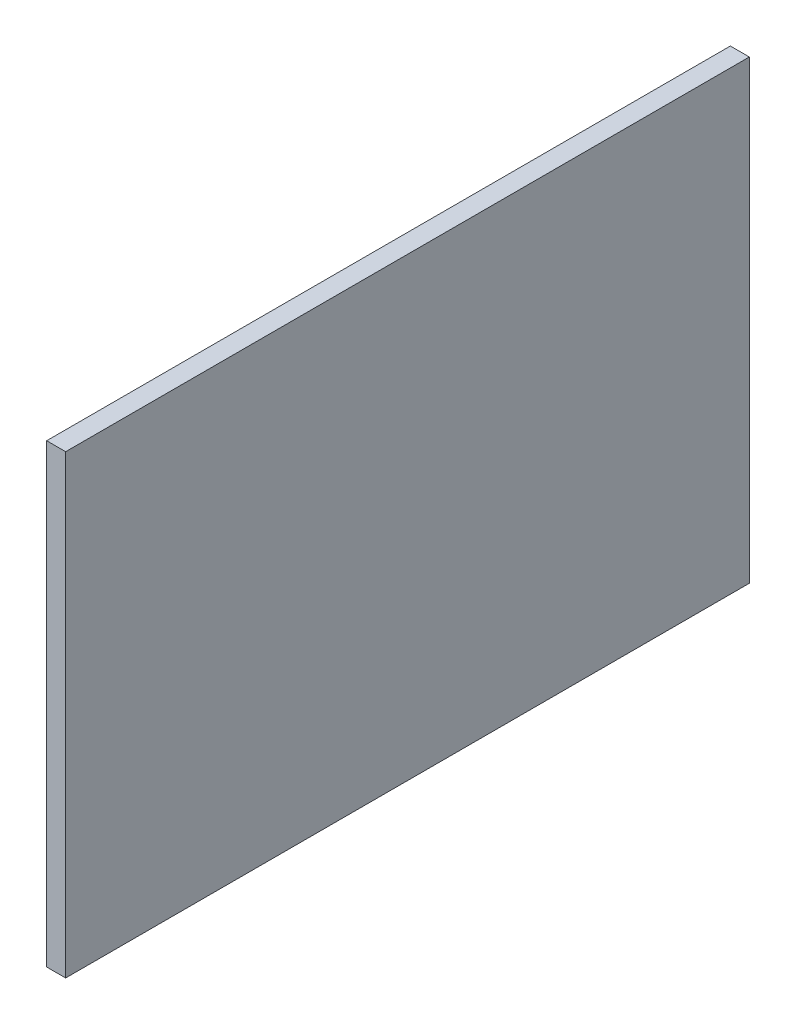
ISO-10303-21;
HEADER;
FILE_DESCRIPTION(('STEP AP214'),'2;1');
FILE_NAME('part.step','',(''),(''),'','','');
FILE_SCHEMA(('AUTOMOTIVE_DESIGN { 1 0 10303 214 1 1 1 1 }'));
ENDSEC;
DATA;
#1=APPLICATION_CONTEXT('core data for automotive mechanical design processes');
#2=APPLICATION_PROTOCOL_DEFINITION('international standard','automotive_design',2000,#1);
#3=PRODUCT_CONTEXT('',#1,'mechanical');
#4=PRODUCT('Part','Part','',(#3));
#5=PRODUCT_RELATED_PRODUCT_CATEGORY('part','',(#4));
#6=PRODUCT_DEFINITION_FORMATION('','',#4);
#7=PRODUCT_DEFINITION_CONTEXT('part definition',#1,'design');
#8=PRODUCT_DEFINITION('design','',#6,#7);
#9=PRODUCT_DEFINITION_SHAPE('','',#8);
#10=(LENGTH_UNIT() NAMED_UNIT(*) SI_UNIT(.MILLI.,.METRE.));
#11=(NAMED_UNIT(*) PLANE_ANGLE_UNIT() SI_UNIT($,.RADIAN.));
#12=(NAMED_UNIT(*) SI_UNIT($,.STERADIAN.) SOLID_ANGLE_UNIT());
#13=UNCERTAINTY_MEASURE_WITH_UNIT(LENGTH_MEASURE(1.E-05),#10,'distance_accuracy_value','');
#14=(GEOMETRIC_REPRESENTATION_CONTEXT(3) GLOBAL_UNCERTAINTY_ASSIGNED_CONTEXT((#13)) GLOBAL_UNIT_ASSIGNED_CONTEXT((#10,
#11,#12)) REPRESENTATION_CONTEXT('',''));
#15=CARTESIAN_POINT('',(0.,0.,0.));
#16=DIRECTION('',(0.,0.,1.));
#17=DIRECTION('',(1.,0.,0.));
#18=AXIS2_PLACEMENT_3D('',#15,#16,#17);
#19=CARTESIAN_POINT('',(12.7,0.,0.));
#20=DIRECTION('',(0.,0.,-1.));
#21=DIRECTION('',(-1.,0.,0.));
#22=AXIS2_PLACEMENT_3D('',#19,#20,#21);
#23=PLANE('',#22);
#24=DIRECTION('',(0.,-1.,0.));
#25=VECTOR('',#24,1.);
#26=CARTESIAN_POINT('',(0.,0.,0.));
#27=LINE('',#26,#25);
#28=CARTESIAN_POINT('',(0.,304.8,0.));
#29=VERTEX_POINT('',#28);
#30=CARTESIAN_POINT('',(0.,0.,0.));
#31=VERTEX_POINT('',#30);
#32=EDGE_CURVE('E107',#29,#31,#27,.T.);
#33=ORIENTED_EDGE('',*,*,#32,.T.);
#34=DIRECTION('',(-1.,0.,0.));
#35=VECTOR('',#34,1.);
#36=CARTESIAN_POINT('',(12.7,0.,0.));
#37=LINE('',#36,#35);
#38=CARTESIAN_POINT('',(12.7,0.,0.));
#39=VERTEX_POINT('',#38);
#40=EDGE_CURVE('E11',#39,#31,#37,.T.);
#41=ORIENTED_EDGE('',*,*,#40,.F.);
#42=DIRECTION('',(0.,-1.,0.));
#43=VECTOR('',#42,1.);
#44=CARTESIAN_POINT('',(12.7,0.,0.));
#45=LINE('',#44,#43);
#46=CARTESIAN_POINT('',(12.7,304.8,0.));
#47=VERTEX_POINT('',#46);
#48=EDGE_CURVE('E91',#47,#39,#45,.T.);
#49=ORIENTED_EDGE('',*,*,#48,.F.);
#50=DIRECTION('',(-1.,0.,0.));
#51=VECTOR('',#50,1.);
#52=CARTESIAN_POINT('',(12.7,304.8,0.));
#53=LINE('',#52,#51);
#54=EDGE_CURVE('E103',#47,#29,#53,.T.);
#55=ORIENTED_EDGE('',*,*,#54,.T.);
#56=EDGE_LOOP('',(#33,#41,#49,#55));
#57=FACE_BOUND('',#56,.T.);
#58=ADVANCED_FACE('F39',(#57),#23,.F.);
#59=CARTESIAN_POINT('',(12.7,0.,0.));
#60=DIRECTION('',(0.,1.,0.));
#61=DIRECTION('',(0.,0.,1.));
#62=AXIS2_PLACEMENT_3D('',#59,#60,#61);
#63=PLANE('',#62);
#64=DIRECTION('',(0.,0.,-1.));
#65=VECTOR('',#64,1.);
#66=CARTESIAN_POINT('',(0.,0.,0.));
#67=LINE('',#66,#65);
#68=CARTESIAN_POINT('',(0.,0.,-457.2));
#69=VERTEX_POINT('',#68);
#70=EDGE_CURVE('E96',#31,#69,#67,.T.);
#71=ORIENTED_EDGE('',*,*,#70,.T.);
#72=DIRECTION('',(-1.,0.,0.));
#73=VECTOR('',#72,1.);
#74=CARTESIAN_POINT('',(12.7,0.,-457.2));
#75=LINE('',#74,#73);
#76=CARTESIAN_POINT('',(12.7,0.,-457.2));
#77=VERTEX_POINT('',#76);
#78=EDGE_CURVE('E48',#77,#69,#75,.T.);
#79=ORIENTED_EDGE('',*,*,#78,.F.);
#80=DIRECTION('',(0.,0.,-1.));
#81=VECTOR('',#80,1.);
#82=CARTESIAN_POINT('',(12.7,0.,0.));
#83=LINE('',#82,#81);
#84=EDGE_CURVE('E86',#39,#77,#83,.T.);
#85=ORIENTED_EDGE('',*,*,#84,.F.);
#86=ORIENTED_EDGE('',*,*,#40,.T.);
#87=EDGE_LOOP('',(#71,#79,#85,#86));
#88=FACE_BOUND('',#87,.T.);
#89=ADVANCED_FACE('F95',(#88),#63,.F.);
#90=CARTESIAN_POINT('',(12.7,0.,-457.2));
#91=DIRECTION('',(0.,0.,1.));
#92=DIRECTION('',(1.,0.,0.));
#93=AXIS2_PLACEMENT_3D('',#90,#91,#92);
#94=PLANE('',#93);
#95=DIRECTION('',(0.,1.,0.));
#96=VECTOR('',#95,1.);
#97=CARTESIAN_POINT('',(0.,0.,-457.2));
#98=LINE('',#97,#96);
#99=CARTESIAN_POINT('',(0.,304.8,-457.2));
#100=VERTEX_POINT('',#99);
#101=EDGE_CURVE('E73',#69,#100,#98,.T.);
#102=ORIENTED_EDGE('',*,*,#101,.T.);
#103=DIRECTION('',(-1.,0.,0.));
#104=VECTOR('',#103,1.);
#105=CARTESIAN_POINT('',(12.7,304.8,-457.2));
#106=LINE('',#105,#104);
#107=CARTESIAN_POINT('',(12.7,304.8,-457.2));
#108=VERTEX_POINT('',#107);
#109=EDGE_CURVE('E98',#108,#100,#106,.T.);
#110=ORIENTED_EDGE('',*,*,#109,.F.);
#111=DIRECTION('',(0.,1.,0.));
#112=VECTOR('',#111,1.);
#113=CARTESIAN_POINT('',(12.7,0.,-457.2));
#114=LINE('',#113,#112);
#115=EDGE_CURVE('E89',#77,#108,#114,.T.);
#116=ORIENTED_EDGE('',*,*,#115,.F.);
#117=ORIENTED_EDGE('',*,*,#78,.T.);
#118=EDGE_LOOP('',(#102,#110,#116,#117));
#119=FACE_BOUND('',#118,.T.);
#120=ADVANCED_FACE('F99',(#119),#94,.F.);
#121=CARTESIAN_POINT('',(12.7,304.8,0.));
#122=DIRECTION('',(0.,-1.,0.));
#123=DIRECTION('',(0.,0.,-1.));
#124=AXIS2_PLACEMENT_3D('',#121,#122,#123);
#125=PLANE('',#124);
#126=DIRECTION('',(0.,0.,1.));
#127=VECTOR('',#126,1.);
#128=CARTESIAN_POINT('',(0.,304.8,0.));
#129=LINE('',#128,#127);
#130=EDGE_CURVE('E79',#100,#29,#129,.T.);
#131=ORIENTED_EDGE('',*,*,#130,.T.);
#132=ORIENTED_EDGE('',*,*,#54,.F.);
#133=DIRECTION('',(0.,0.,1.));
#134=VECTOR('',#133,1.);
#135=CARTESIAN_POINT('',(12.7,304.8,0.));
#136=LINE('',#135,#134);
#137=EDGE_CURVE('E56',#108,#47,#136,.T.);
#138=ORIENTED_EDGE('',*,*,#137,.F.);
#139=ORIENTED_EDGE('',*,*,#109,.T.);
#140=EDGE_LOOP('',(#131,#132,#138,#139));
#141=FACE_BOUND('',#140,.T.);
#142=ADVANCED_FACE('F120',(#141),#125,.F.);
#143=CARTESIAN_POINT('',(12.7,0.,0.));
#144=DIRECTION('',(-1.,0.,0.));
#145=DIRECTION('',(0.,0.,1.));
#146=AXIS2_PLACEMENT_3D('',#143,#144,#145);
#147=PLANE('',#146);
#148=ORIENTED_EDGE('',*,*,#48,.T.);
#149=ORIENTED_EDGE('',*,*,#84,.T.);
#150=ORIENTED_EDGE('',*,*,#115,.T.);
#151=ORIENTED_EDGE('',*,*,#137,.T.);
#152=EDGE_LOOP('',(#148,#149,#150,#151));
#153=FACE_BOUND('',#152,.T.);
#154=ADVANCED_FACE('F87',(#153),#147,.F.);
#155=CARTESIAN_POINT('',(0.,0.,0.));
#156=DIRECTION('',(-1.,0.,0.));
#157=DIRECTION('',(0.,0.,1.));
#158=AXIS2_PLACEMENT_3D('',#155,#156,#157);
#159=PLANE('',#158);
#160=ORIENTED_EDGE('',*,*,#32,.F.);
#161=ORIENTED_EDGE('',*,*,#130,.F.);
#162=ORIENTED_EDGE('',*,*,#101,.F.);
#163=ORIENTED_EDGE('',*,*,#70,.F.);
#164=EDGE_LOOP('',(#160,#161,#162,#163));
#165=FACE_BOUND('',#164,.T.);
#166=ADVANCED_FACE('F123',(#165),#159,.T.);
#167=CLOSED_SHELL('',(#58,#89,#120,#142,#154,#166));
#168=MANIFOLD_SOLID_BREP('B2',#167);
#169=ADVANCED_BREP_SHAPE_REPRESENTATION('',(#18,#168),#14);
#170=SHAPE_DEFINITION_REPRESENTATION(#9,#169);
ENDSEC;
END-ISO-10303-21;
